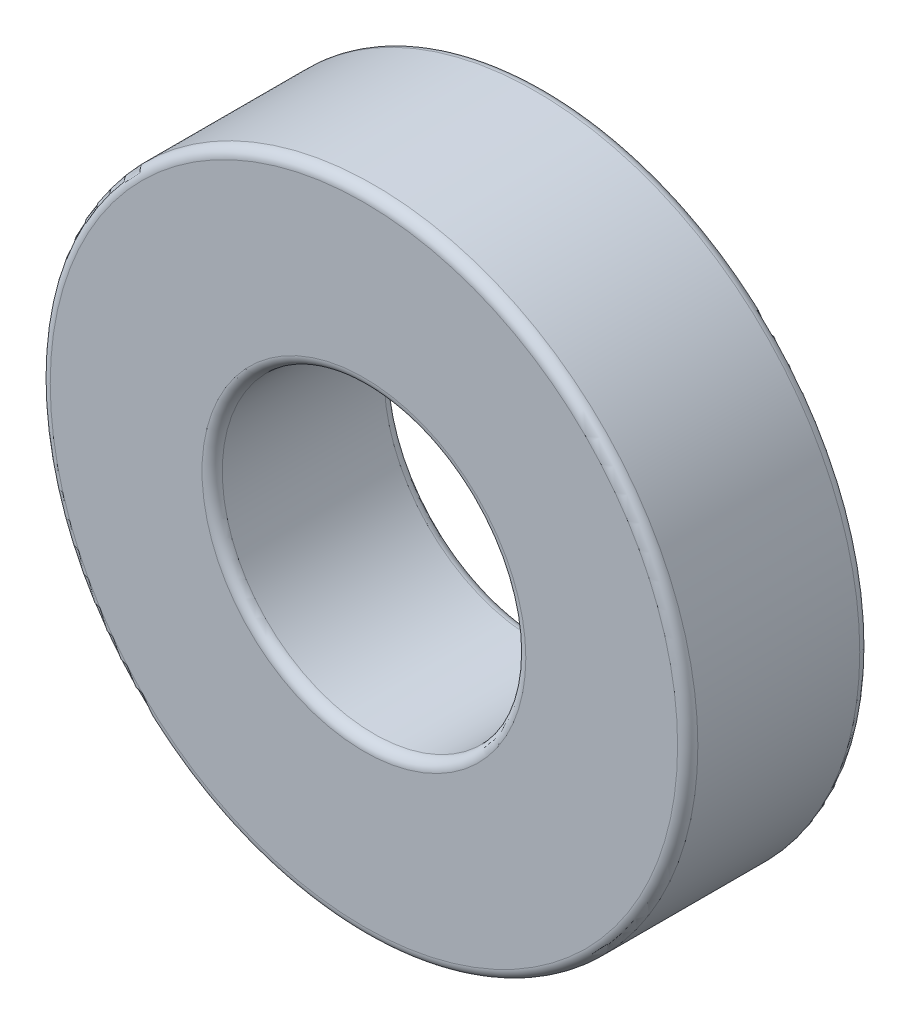
ISO-10303-21;
HEADER;
FILE_DESCRIPTION(('STEP AP214'),'2;1');
FILE_NAME('part.step','',(''),(''),'','','');
FILE_SCHEMA(('AUTOMOTIVE_DESIGN { 1 0 10303 214 1 1 1 1 }'));
ENDSEC;
DATA;
#1=APPLICATION_CONTEXT('core data for automotive mechanical design processes');
#2=APPLICATION_PROTOCOL_DEFINITION('international standard','automotive_design',2000,#1);
#3=PRODUCT_CONTEXT('',#1,'mechanical');
#4=PRODUCT('Part','Part','',(#3));
#5=PRODUCT_RELATED_PRODUCT_CATEGORY('part','',(#4));
#6=PRODUCT_DEFINITION_FORMATION('','',#4);
#7=PRODUCT_DEFINITION_CONTEXT('part definition',#1,'design');
#8=PRODUCT_DEFINITION('design','',#6,#7);
#9=PRODUCT_DEFINITION_SHAPE('','',#8);
#10=(LENGTH_UNIT() NAMED_UNIT(*) SI_UNIT(.MILLI.,.METRE.));
#11=(NAMED_UNIT(*) PLANE_ANGLE_UNIT() SI_UNIT($,.RADIAN.));
#12=(NAMED_UNIT(*) SI_UNIT($,.STERADIAN.) SOLID_ANGLE_UNIT());
#13=UNCERTAINTY_MEASURE_WITH_UNIT(LENGTH_MEASURE(1.E-05),#10,'distance_accuracy_value','');
#14=(GEOMETRIC_REPRESENTATION_CONTEXT(3) GLOBAL_UNCERTAINTY_ASSIGNED_CONTEXT((#13)) GLOBAL_UNIT_ASSIGNED_CONTEXT((#10,
#11,#12)) REPRESENTATION_CONTEXT('',''));
#15=CARTESIAN_POINT('',(0.,0.,0.));
#16=DIRECTION('',(0.,0.,1.));
#17=DIRECTION('',(1.,0.,0.));
#18=AXIS2_PLACEMENT_3D('',#15,#16,#17);
#19=CARTESIAN_POINT('',(0.,0.,9.));
#20=DIRECTION('',(0.,0.,1.));
#21=DIRECTION('',(1.,0.,0.));
#22=AXIS2_PLACEMENT_3D('',#19,#20,#21);
#23=PLANE('',#22);
#24=CARTESIAN_POINT('',(0.,0.,9.));
#25=DIRECTION('',(0.,0.,1.));
#26=DIRECTION('',(1.,0.,0.));
#27=AXIS2_PLACEMENT_3D('',#24,#25,#26);
#28=CIRCLE('',#27,8.);
#29=CARTESIAN_POINT('',(8.,0.,9.));
#30=VERTEX_POINT('',#29);
#31=EDGE_CURVE('E10',#30,#30,#28,.F.);
#32=ORIENTED_EDGE('',*,*,#31,.T.);
#33=EDGE_LOOP('',(#32));
#34=FACE_BOUND('',#33,.T.);
#35=CARTESIAN_POINT('',(0.,0.,9.));
#36=DIRECTION('',(0.,0.,1.));
#37=DIRECTION('',(1.,0.,0.));
#38=AXIS2_PLACEMENT_3D('',#35,#36,#37);
#39=CIRCLE('',#38,15.5);
#40=CARTESIAN_POINT('',(15.5,0.,9.));
#41=VERTEX_POINT('',#40);
#42=EDGE_CURVE('E40',#41,#41,#39,.T.);
#43=ORIENTED_EDGE('',*,*,#42,.T.);
#44=EDGE_LOOP('',(#43));
#45=FACE_BOUND('',#44,.T.);
#46=ADVANCED_FACE('F33',(#34,#45),#23,.T.);
#47=CARTESIAN_POINT('',(0.,0.,0.));
#48=DIRECTION('',(0.,0.,1.));
#49=DIRECTION('',(1.,0.,0.));
#50=AXIS2_PLACEMENT_3D('',#47,#48,#49);
#51=PLANE('',#50);
#52=CARTESIAN_POINT('',(0.,0.,0.));
#53=DIRECTION('',(0.,0.,1.));
#54=DIRECTION('',(1.,0.,0.));
#55=AXIS2_PLACEMENT_3D('',#52,#53,#54);
#56=CIRCLE('',#55,8.);
#57=CARTESIAN_POINT('',(8.,0.,0.));
#58=VERTEX_POINT('',#57);
#59=EDGE_CURVE('E59',#58,#58,#56,.T.);
#60=ORIENTED_EDGE('',*,*,#59,.T.);
#61=EDGE_LOOP('',(#60));
#62=FACE_BOUND('',#61,.T.);
#63=CARTESIAN_POINT('',(0.,0.,0.));
#64=DIRECTION('',(0.,0.,1.));
#65=DIRECTION('',(1.,0.,0.));
#66=AXIS2_PLACEMENT_3D('',#63,#64,#65);
#67=CIRCLE('',#66,15.5);
#68=CARTESIAN_POINT('',(15.5,0.,0.));
#69=VERTEX_POINT('',#68);
#70=EDGE_CURVE('E62',#69,#69,#67,.F.);
#71=ORIENTED_EDGE('',*,*,#70,.T.);
#72=EDGE_LOOP('',(#71));
#73=FACE_BOUND('',#72,.T.);
#74=ADVANCED_FACE('F66',(#62,#73),#51,.F.);
#75=CARTESIAN_POINT('',(0.,0.,9.));
#76=DIRECTION('',(0.,0.,-1.));
#77=DIRECTION('',(-1.,0.,0.));
#78=AXIS2_PLACEMENT_3D('',#75,#76,#77);
#79=CYLINDRICAL_SURFACE('',#78,16.);
#80=CARTESIAN_POINT('',(0.,0.,0.5));
#81=DIRECTION('',(0.,0.,1.));
#82=DIRECTION('',(1.,0.,0.));
#83=AXIS2_PLACEMENT_3D('',#80,#81,#82);
#84=CIRCLE('',#83,16.);
#85=CARTESIAN_POINT('',(16.,0.,0.5));
#86=VERTEX_POINT('',#85);
#87=EDGE_CURVE('E44',#86,#86,#84,.T.);
#88=ORIENTED_EDGE('',*,*,#87,.T.);
#89=EDGE_LOOP('',(#88));
#90=FACE_BOUND('',#89,.T.);
#91=CARTESIAN_POINT('',(0.,0.,8.5));
#92=DIRECTION('',(0.,0.,1.));
#93=DIRECTION('',(1.,0.,0.));
#94=AXIS2_PLACEMENT_3D('',#91,#92,#93);
#95=CIRCLE('',#94,16.);
#96=CARTESIAN_POINT('',(16.,0.,8.5));
#97=VERTEX_POINT('',#96);
#98=EDGE_CURVE('E48',#97,#97,#95,.F.);
#99=ORIENTED_EDGE('',*,*,#98,.T.);
#100=EDGE_LOOP('',(#99));
#101=FACE_BOUND('',#100,.T.);
#102=ADVANCED_FACE('F76',(#90,#101),#79,.T.);
#103=CARTESIAN_POINT('',(0.,0.,9.));
#104=DIRECTION('',(0.,0.,-1.));
#105=DIRECTION('',(-1.,0.,0.));
#106=AXIS2_PLACEMENT_3D('',#103,#104,#105);
#107=CYLINDRICAL_SURFACE('',#106,7.5);
#108=CARTESIAN_POINT('',(0.,0.,0.5));
#109=DIRECTION('',(0.,0.,1.));
#110=DIRECTION('',(1.,0.,0.));
#111=AXIS2_PLACEMENT_3D('',#108,#109,#110);
#112=CIRCLE('',#111,7.5);
#113=CARTESIAN_POINT('',(7.5,0.,0.5));
#114=VERTEX_POINT('',#113);
#115=EDGE_CURVE('E53',#114,#114,#112,.F.);
#116=ORIENTED_EDGE('',*,*,#115,.T.);
#117=EDGE_LOOP('',(#116));
#118=FACE_BOUND('',#117,.T.);
#119=CARTESIAN_POINT('',(0.,0.,8.5));
#120=DIRECTION('',(0.,0.,1.));
#121=DIRECTION('',(1.,0.,0.));
#122=AXIS2_PLACEMENT_3D('',#119,#120,#121);
#123=CIRCLE('',#122,7.5);
#124=CARTESIAN_POINT('',(7.5,0.,8.5));
#125=VERTEX_POINT('',#124);
#126=EDGE_CURVE('E56',#125,#125,#123,.T.);
#127=ORIENTED_EDGE('',*,*,#126,.T.);
#128=EDGE_LOOP('',(#127));
#129=FACE_BOUND('',#128,.T.);
#130=ADVANCED_FACE('F79',(#118,#129),#107,.F.);
#131=CARTESIAN_POINT('',(0.,0.,0.5));
#132=DIRECTION('',(0.,0.,1.));
#133=DIRECTION('',(1.,0.,0.));
#134=AXIS2_PLACEMENT_3D('',#131,#132,#133);
#135=TOROIDAL_SURFACE('',#134,8.,0.5);
#136=ORIENTED_EDGE('',*,*,#115,.F.);
#137=EDGE_LOOP('',(#136));
#138=FACE_BOUND('',#137,.T.);
#139=ORIENTED_EDGE('',*,*,#59,.F.);
#140=EDGE_LOOP('',(#139));
#141=FACE_BOUND('',#140,.T.);
#142=ADVANCED_FACE('F72',(#138,#141),#135,.T.);
#143=CARTESIAN_POINT('',(0.,0.,0.5));
#144=DIRECTION('',(0.,0.,1.));
#145=DIRECTION('',(1.,0.,0.));
#146=AXIS2_PLACEMENT_3D('',#143,#144,#145);
#147=TOROIDAL_SURFACE('',#146,15.5,0.5);
#148=ORIENTED_EDGE('',*,*,#70,.F.);
#149=EDGE_LOOP('',(#148));
#150=FACE_BOUND('',#149,.T.);
#151=ORIENTED_EDGE('',*,*,#87,.F.);
#152=EDGE_LOOP('',(#151));
#153=FACE_BOUND('',#152,.T.);
#154=ADVANCED_FACE('F68',(#150,#153),#147,.T.);
#155=CARTESIAN_POINT('',(0.,0.,8.5));
#156=DIRECTION('',(0.,0.,1.));
#157=DIRECTION('',(1.,0.,0.));
#158=AXIS2_PLACEMENT_3D('',#155,#156,#157);
#159=TOROIDAL_SURFACE('',#158,8.,0.5);
#160=ORIENTED_EDGE('',*,*,#31,.F.);
#161=EDGE_LOOP('',(#160));
#162=FACE_BOUND('',#161,.T.);
#163=ORIENTED_EDGE('',*,*,#126,.F.);
#164=EDGE_LOOP('',(#163));
#165=FACE_BOUND('',#164,.T.);
#166=ADVANCED_FACE('F71',(#162,#165),#159,.T.);
#167=CARTESIAN_POINT('',(0.,0.,8.5));
#168=DIRECTION('',(0.,0.,1.));
#169=DIRECTION('',(1.,0.,0.));
#170=AXIS2_PLACEMENT_3D('',#167,#168,#169);
#171=TOROIDAL_SURFACE('',#170,15.5,0.5);
#172=ORIENTED_EDGE('',*,*,#98,.F.);
#173=EDGE_LOOP('',(#172));
#174=FACE_BOUND('',#173,.T.);
#175=ORIENTED_EDGE('',*,*,#42,.F.);
#176=EDGE_LOOP('',(#175));
#177=FACE_BOUND('',#176,.T.);
#178=ADVANCED_FACE('F35',(#174,#177),#171,.T.);
#179=CLOSED_SHELL('',(#46,#74,#102,#130,#142,#154,#166,#178));
#180=MANIFOLD_SOLID_BREP('B2',#179);
#181=ADVANCED_BREP_SHAPE_REPRESENTATION('',(#18,#180),#14);
#182=SHAPE_DEFINITION_REPRESENTATION(#9,#181);
ENDSEC;
END-ISO-10303-21;
